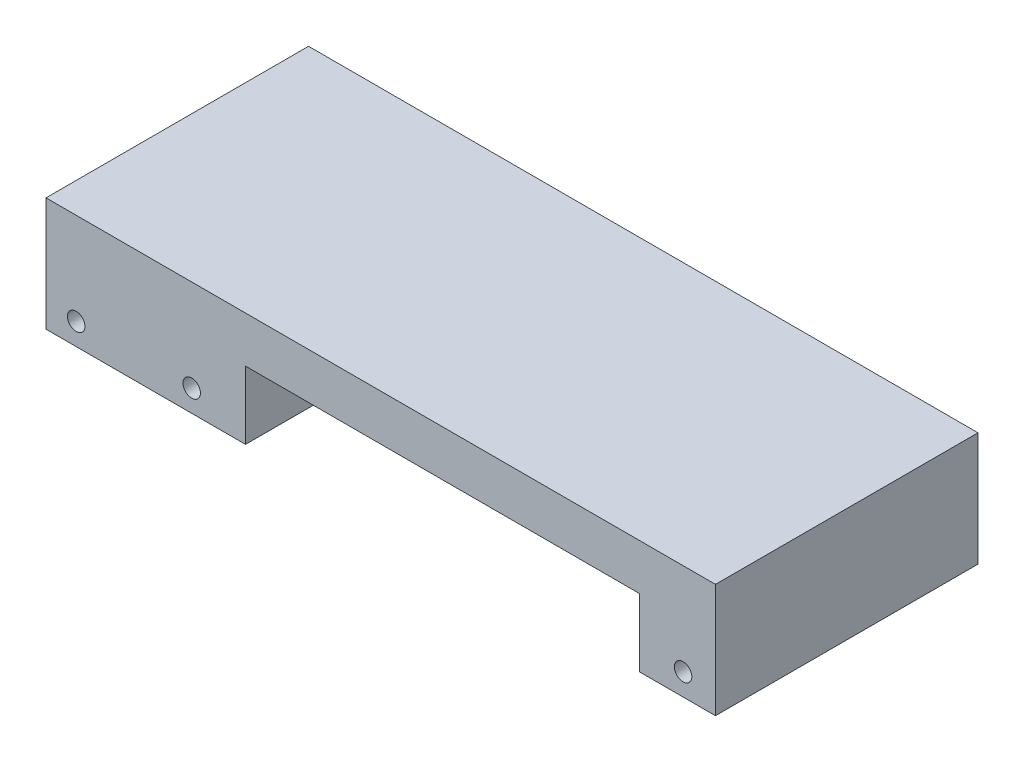
ISO-10303-21;
HEADER;
FILE_DESCRIPTION(('STEP AP214'),'2;1');
FILE_NAME('part.step','',(''),(''),'','','');
FILE_SCHEMA(('AUTOMOTIVE_DESIGN { 1 0 10303 214 1 1 1 1 }'));
ENDSEC;
DATA;
#1=APPLICATION_CONTEXT('core data for automotive mechanical design processes');
#2=APPLICATION_PROTOCOL_DEFINITION('international standard','automotive_design',2000,#1);
#3=PRODUCT_CONTEXT('',#1,'mechanical');
#4=PRODUCT('Part','Part','',(#3));
#5=PRODUCT_RELATED_PRODUCT_CATEGORY('part','',(#4));
#6=PRODUCT_DEFINITION_FORMATION('','',#4);
#7=PRODUCT_DEFINITION_CONTEXT('part definition',#1,'design');
#8=PRODUCT_DEFINITION('design','',#6,#7);
#9=PRODUCT_DEFINITION_SHAPE('','',#8);
#10=(LENGTH_UNIT() NAMED_UNIT(*) SI_UNIT(.MILLI.,.METRE.));
#11=(NAMED_UNIT(*) PLANE_ANGLE_UNIT() SI_UNIT($,.RADIAN.));
#12=(NAMED_UNIT(*) SI_UNIT($,.STERADIAN.) SOLID_ANGLE_UNIT());
#13=UNCERTAINTY_MEASURE_WITH_UNIT(LENGTH_MEASURE(1.E-05),#10,'distance_accuracy_value','');
#14=(GEOMETRIC_REPRESENTATION_CONTEXT(3) GLOBAL_UNCERTAINTY_ASSIGNED_CONTEXT((#13)) GLOBAL_UNIT_ASSIGNED_CONTEXT((#10,
#11,#12)) REPRESENTATION_CONTEXT('',''));
#15=CARTESIAN_POINT('',(0.,0.,0.));
#16=DIRECTION('',(0.,0.,1.));
#17=DIRECTION('',(1.,0.,0.));
#18=AXIS2_PLACEMENT_3D('',#15,#16,#17);
#19=CARTESIAN_POINT('',(29.55,0.,30.));
#20=DIRECTION('',(-1.,0.,0.));
#21=DIRECTION('',(0.,0.,1.));
#22=AXIS2_PLACEMENT_3D('',#19,#20,#21);
#23=PLANE('',#22);
#24=DIRECTION('',(0.,1.,0.));
#25=VECTOR('',#24,1.);
#26=CARTESIAN_POINT('',(29.55,0.,0.));
#27=LINE('',#26,#25);
#28=CARTESIAN_POINT('',(29.55,-6.5,0.));
#29=VERTEX_POINT('',#28);
#30=CARTESIAN_POINT('',(29.55,1.25,0.));
#31=VERTEX_POINT('',#30);
#32=EDGE_CURVE('E172',#29,#31,#27,.T.);
#33=ORIENTED_EDGE('',*,*,#32,.F.);
#34=DIRECTION('',(0.,0.,-1.));
#35=VECTOR('',#34,1.);
#36=CARTESIAN_POINT('',(29.55,-6.5,30.));
#37=LINE('',#36,#35);
#38=CARTESIAN_POINT('',(29.55,-6.5,30.));
#39=VERTEX_POINT('',#38);
#40=EDGE_CURVE('E11',#39,#29,#37,.T.);
#41=ORIENTED_EDGE('',*,*,#40,.F.);
#42=DIRECTION('',(0.,1.,0.));
#43=VECTOR('',#42,1.);
#44=CARTESIAN_POINT('',(29.55,0.,30.));
#45=LINE('',#44,#43);
#46=CARTESIAN_POINT('',(29.55,1.25,30.));
#47=VERTEX_POINT('',#46);
#48=EDGE_CURVE('E264',#39,#47,#45,.T.);
#49=ORIENTED_EDGE('',*,*,#48,.T.);
#50=DIRECTION('',(0.,0.,-1.));
#51=VECTOR('',#50,1.);
#52=CARTESIAN_POINT('',(29.55,1.25,30.));
#53=LINE('',#52,#51);
#54=EDGE_CURVE('E97',#47,#31,#53,.T.);
#55=ORIENTED_EDGE('',*,*,#54,.T.);
#56=EDGE_LOOP('',(#33,#41,#49,#55));
#57=FACE_BOUND('',#56,.T.);
#58=ADVANCED_FACE('F45',(#57),#23,.T.);
#59=CARTESIAN_POINT('',(0.,-6.5,30.));
#60=DIRECTION('',(0.,1.,0.));
#61=DIRECTION('',(0.,0.,1.));
#62=AXIS2_PLACEMENT_3D('',#59,#60,#61);
#63=PLANE('',#62);
#64=DIRECTION('',(1.,0.,0.));
#65=VECTOR('',#64,1.);
#66=CARTESIAN_POINT('',(0.,-6.5,0.));
#67=LINE('',#66,#65);
#68=CARTESIAN_POINT('',(38.25,-6.5,0.));
#69=VERTEX_POINT('',#68);
#70=EDGE_CURVE('E169',#29,#69,#67,.T.);
#71=ORIENTED_EDGE('',*,*,#70,.T.);
#72=DIRECTION('',(0.,0.,-1.));
#73=VECTOR('',#72,1.);
#74=CARTESIAN_POINT('',(38.25,-6.5,30.));
#75=LINE('',#74,#73);
#76=CARTESIAN_POINT('',(38.25,-6.5,30.));
#77=VERTEX_POINT('',#76);
#78=EDGE_CURVE('E55',#77,#69,#75,.T.);
#79=ORIENTED_EDGE('',*,*,#78,.F.);
#80=DIRECTION('',(1.,0.,0.));
#81=VECTOR('',#80,1.);
#82=CARTESIAN_POINT('',(0.,-6.5,30.));
#83=LINE('',#82,#81);
#84=EDGE_CURVE('E137',#39,#77,#83,.T.);
#85=ORIENTED_EDGE('',*,*,#84,.F.);
#86=ORIENTED_EDGE('',*,*,#40,.T.);
#87=EDGE_LOOP('',(#71,#79,#85,#86));
#88=FACE_BOUND('',#87,.T.);
#89=ADVANCED_FACE('F170',(#88),#63,.F.);
#90=CARTESIAN_POINT('',(38.25,0.,30.));
#91=DIRECTION('',(-1.,0.,0.));
#92=DIRECTION('',(0.,0.,1.));
#93=AXIS2_PLACEMENT_3D('',#90,#91,#92);
#94=PLANE('',#93);
#95=DIRECTION('',(0.,1.,0.));
#96=VECTOR('',#95,1.);
#97=CARTESIAN_POINT('',(38.25,0.,0.));
#98=LINE('',#97,#96);
#99=CARTESIAN_POINT('',(38.25,6.5,0.));
#100=VERTEX_POINT('',#99);
#101=EDGE_CURVE('E163',#69,#100,#98,.T.);
#102=ORIENTED_EDGE('',*,*,#101,.T.);
#103=DIRECTION('',(0.,0.,-1.));
#104=VECTOR('',#103,1.);
#105=CARTESIAN_POINT('',(38.25,6.5,30.));
#106=LINE('',#105,#104);
#107=CARTESIAN_POINT('',(38.25,6.5,30.));
#108=VERTEX_POINT('',#107);
#109=EDGE_CURVE('E153',#108,#100,#106,.T.);
#110=ORIENTED_EDGE('',*,*,#109,.F.);
#111=DIRECTION('',(0.,1.,0.));
#112=VECTOR('',#111,1.);
#113=CARTESIAN_POINT('',(38.25,0.,30.));
#114=LINE('',#113,#112);
#115=EDGE_CURVE('E165',#77,#108,#114,.T.);
#116=ORIENTED_EDGE('',*,*,#115,.F.);
#117=ORIENTED_EDGE('',*,*,#78,.T.);
#118=EDGE_LOOP('',(#102,#110,#116,#117));
#119=FACE_BOUND('',#118,.T.);
#120=ADVANCED_FACE('F161',(#119),#94,.F.);
#121=CARTESIAN_POINT('',(0.,6.5,30.));
#122=DIRECTION('',(0.,1.,0.));
#123=DIRECTION('',(0.,0.,1.));
#124=AXIS2_PLACEMENT_3D('',#121,#122,#123);
#125=PLANE('',#124);
#126=DIRECTION('',(1.,0.,0.));
#127=VECTOR('',#126,1.);
#128=CARTESIAN_POINT('',(0.,6.5,0.));
#129=LINE('',#128,#127);
#130=CARTESIAN_POINT('',(-38.25,6.5,0.));
#131=VERTEX_POINT('',#130);
#132=EDGE_CURVE('E176',#131,#100,#129,.T.);
#133=ORIENTED_EDGE('',*,*,#132,.F.);
#134=DIRECTION('',(0.,0.,-1.));
#135=VECTOR('',#134,1.);
#136=CARTESIAN_POINT('',(-38.25,6.5,30.));
#137=LINE('',#136,#135);
#138=CARTESIAN_POINT('',(-38.25,6.5,30.));
#139=VERTEX_POINT('',#138);
#140=EDGE_CURVE('E146',#139,#131,#137,.T.);
#141=ORIENTED_EDGE('',*,*,#140,.F.);
#142=DIRECTION('',(1.,0.,0.));
#143=VECTOR('',#142,1.);
#144=CARTESIAN_POINT('',(0.,6.5,30.));
#145=LINE('',#144,#143);
#146=EDGE_CURVE('E275',#139,#108,#145,.T.);
#147=ORIENTED_EDGE('',*,*,#146,.T.);
#148=ORIENTED_EDGE('',*,*,#109,.T.);
#149=EDGE_LOOP('',(#133,#141,#147,#148));
#150=FACE_BOUND('',#149,.T.);
#151=ADVANCED_FACE('F234',(#150),#125,.T.);
#152=CARTESIAN_POINT('',(-38.25,0.,30.));
#153=DIRECTION('',(-1.,0.,0.));
#154=DIRECTION('',(0.,0.,1.));
#155=AXIS2_PLACEMENT_3D('',#152,#153,#154);
#156=PLANE('',#155);
#157=DIRECTION('',(0.,1.,0.));
#158=VECTOR('',#157,1.);
#159=CARTESIAN_POINT('',(-38.25,0.,0.));
#160=LINE('',#159,#158);
#161=CARTESIAN_POINT('',(-38.25,-6.5,0.));
#162=VERTEX_POINT('',#161);
#163=EDGE_CURVE('E182',#162,#131,#160,.T.);
#164=ORIENTED_EDGE('',*,*,#163,.F.);
#165=DIRECTION('',(0.,0.,-1.));
#166=VECTOR('',#165,1.);
#167=CARTESIAN_POINT('',(-38.25,-6.5,30.));
#168=LINE('',#167,#166);
#169=CARTESIAN_POINT('',(-38.25,-6.5,30.));
#170=VERTEX_POINT('',#169);
#171=EDGE_CURVE('E142',#170,#162,#168,.T.);
#172=ORIENTED_EDGE('',*,*,#171,.F.);
#173=DIRECTION('',(0.,1.,0.));
#174=VECTOR('',#173,1.);
#175=CARTESIAN_POINT('',(-38.25,0.,30.));
#176=LINE('',#175,#174);
#177=EDGE_CURVE('E133',#170,#139,#176,.T.);
#178=ORIENTED_EDGE('',*,*,#177,.T.);
#179=ORIENTED_EDGE('',*,*,#140,.T.);
#180=EDGE_LOOP('',(#164,#172,#178,#179));
#181=FACE_BOUND('',#180,.T.);
#182=ADVANCED_FACE('F237',(#181),#156,.T.);
#183=CARTESIAN_POINT('',(-15.45,-6.5,0.));
#184=VERTEX_POINT('',#183);
#185=EDGE_CURVE('E140',#162,#184,#67,.T.);
#186=ORIENTED_EDGE('',*,*,#185,.T.);
#187=DIRECTION('',(0.,0.,-1.));
#188=VECTOR('',#187,1.);
#189=CARTESIAN_POINT('',(-15.45,-6.5,30.));
#190=LINE('',#189,#188);
#191=CARTESIAN_POINT('',(-15.45,-6.5,30.));
#192=VERTEX_POINT('',#191);
#193=EDGE_CURVE('E122',#192,#184,#190,.T.);
#194=ORIENTED_EDGE('',*,*,#193,.F.);
#195=EDGE_CURVE('E126',#170,#192,#83,.T.);
#196=ORIENTED_EDGE('',*,*,#195,.F.);
#197=ORIENTED_EDGE('',*,*,#171,.T.);
#198=EDGE_LOOP('',(#186,#194,#196,#197));
#199=FACE_BOUND('',#198,.T.);
#200=ADVANCED_FACE('F138',(#199),#63,.F.);
#201=CARTESIAN_POINT('',(-15.45,0.,30.));
#202=DIRECTION('',(-1.,0.,0.));
#203=DIRECTION('',(0.,0.,1.));
#204=AXIS2_PLACEMENT_3D('',#201,#202,#203);
#205=PLANE('',#204);
#206=DIRECTION('',(0.,1.,0.));
#207=VECTOR('',#206,1.);
#208=CARTESIAN_POINT('',(-15.45,0.,0.));
#209=LINE('',#208,#207);
#210=CARTESIAN_POINT('',(-15.45,1.25,0.));
#211=VERTEX_POINT('',#210);
#212=EDGE_CURVE('E181',#184,#211,#209,.T.);
#213=ORIENTED_EDGE('',*,*,#212,.T.);
#214=DIRECTION('',(0.,0.,-1.));
#215=VECTOR('',#214,1.);
#216=CARTESIAN_POINT('',(-15.45,1.25,30.));
#217=LINE('',#216,#215);
#218=CARTESIAN_POINT('',(-15.45,1.25,30.));
#219=VERTEX_POINT('',#218);
#220=EDGE_CURVE('E124',#219,#211,#217,.T.);
#221=ORIENTED_EDGE('',*,*,#220,.F.);
#222=DIRECTION('',(0.,1.,0.));
#223=VECTOR('',#222,1.);
#224=CARTESIAN_POINT('',(-15.45,0.,30.));
#225=LINE('',#224,#223);
#226=EDGE_CURVE('E117',#192,#219,#225,.T.);
#227=ORIENTED_EDGE('',*,*,#226,.F.);
#228=ORIENTED_EDGE('',*,*,#193,.T.);
#229=EDGE_LOOP('',(#213,#221,#227,#228));
#230=FACE_BOUND('',#229,.T.);
#231=ADVANCED_FACE('F120',(#230),#205,.F.);
#232=CARTESIAN_POINT('',(-34.8,-4.,30.));
#233=DIRECTION('',(0.,0.,-1.));
#234=DIRECTION('',(-1.,0.,0.));
#235=AXIS2_PLACEMENT_3D('',#232,#233,#234);
#236=CYLINDRICAL_SURFACE('',#235,0.999999999999998);
#237=CARTESIAN_POINT('',(-34.8,-4.,30.));
#238=DIRECTION('',(0.,0.,1.));
#239=DIRECTION('',(1.,0.,0.));
#240=AXIS2_PLACEMENT_3D('',#237,#238,#239);
#241=CIRCLE('',#240,0.999999999999998);
#242=CARTESIAN_POINT('',(-33.8,-4.,30.));
#243=VERTEX_POINT('',#242);
#244=EDGE_CURVE('E262',#243,#243,#241,.T.);
#245=ORIENTED_EDGE('',*,*,#244,.T.);
#246=EDGE_LOOP('',(#245));
#247=FACE_BOUND('',#246,.T.);
#248=CARTESIAN_POINT('',(-34.8,-4.,0.));
#249=DIRECTION('',(0.,0.,1.));
#250=DIRECTION('',(1.,0.,0.));
#251=AXIS2_PLACEMENT_3D('',#248,#249,#250);
#252=CIRCLE('',#251,0.999999999999998);
#253=CARTESIAN_POINT('',(-33.8,-4.,0.));
#254=VERTEX_POINT('',#253);
#255=EDGE_CURVE('E178',#254,#254,#252,.T.);
#256=ORIENTED_EDGE('',*,*,#255,.F.);
#257=EDGE_LOOP('',(#256));
#258=FACE_BOUND('',#257,.T.);
#259=ADVANCED_FACE('F213',(#247,#258),#236,.F.);
#260=CARTESIAN_POINT('',(-21.6,-4.,30.));
#261=DIRECTION('',(0.,0.,-1.));
#262=DIRECTION('',(-1.,0.,0.));
#263=AXIS2_PLACEMENT_3D('',#260,#261,#262);
#264=CYLINDRICAL_SURFACE('',#263,1.);
#265=CARTESIAN_POINT('',(-21.6,-4.,30.));
#266=DIRECTION('',(0.,0.,1.));
#267=DIRECTION('',(1.,0.,0.));
#268=AXIS2_PLACEMENT_3D('',#265,#266,#267);
#269=CIRCLE('',#268,1.);
#270=CARTESIAN_POINT('',(-20.6,-4.,30.));
#271=VERTEX_POINT('',#270);
#272=EDGE_CURVE('E260',#271,#271,#269,.T.);
#273=ORIENTED_EDGE('',*,*,#272,.T.);
#274=EDGE_LOOP('',(#273));
#275=FACE_BOUND('',#274,.T.);
#276=CARTESIAN_POINT('',(-21.6,-4.,0.));
#277=DIRECTION('',(0.,0.,1.));
#278=DIRECTION('',(1.,0.,0.));
#279=AXIS2_PLACEMENT_3D('',#276,#277,#278);
#280=CIRCLE('',#279,1.);
#281=CARTESIAN_POINT('',(-20.6,-4.,0.));
#282=VERTEX_POINT('',#281);
#283=EDGE_CURVE('E203',#282,#282,#280,.T.);
#284=ORIENTED_EDGE('',*,*,#283,.F.);
#285=EDGE_LOOP('',(#284));
#286=FACE_BOUND('',#285,.T.);
#287=ADVANCED_FACE('F215',(#275,#286),#264,.F.);
#288=CARTESIAN_POINT('',(34.55,-4.,30.));
#289=DIRECTION('',(0.,0.,-1.));
#290=DIRECTION('',(-1.,0.,0.));
#291=AXIS2_PLACEMENT_3D('',#288,#289,#290);
#292=CYLINDRICAL_SURFACE('',#291,0.999999999999998);
#293=CARTESIAN_POINT('',(34.55,-4.,30.));
#294=DIRECTION('',(0.,0.,1.));
#295=DIRECTION('',(1.,0.,0.));
#296=AXIS2_PLACEMENT_3D('',#293,#294,#295);
#297=CIRCLE('',#296,0.999999999999998);
#298=CARTESIAN_POINT('',(35.55,-4.,30.));
#299=VERTEX_POINT('',#298);
#300=EDGE_CURVE('E193',#299,#299,#297,.T.);
#301=ORIENTED_EDGE('',*,*,#300,.T.);
#302=EDGE_LOOP('',(#301));
#303=FACE_BOUND('',#302,.T.);
#304=CARTESIAN_POINT('',(34.55,-4.,0.));
#305=DIRECTION('',(0.,0.,1.));
#306=DIRECTION('',(1.,0.,0.));
#307=AXIS2_PLACEMENT_3D('',#304,#305,#306);
#308=CIRCLE('',#307,0.999999999999998);
#309=CARTESIAN_POINT('',(35.55,-4.,0.));
#310=VERTEX_POINT('',#309);
#311=EDGE_CURVE('E199',#310,#310,#308,.T.);
#312=ORIENTED_EDGE('',*,*,#311,.F.);
#313=EDGE_LOOP('',(#312));
#314=FACE_BOUND('',#313,.T.);
#315=ADVANCED_FACE('F47',(#303,#314),#292,.F.);
#316=CARTESIAN_POINT('',(0.,1.25,30.));
#317=DIRECTION('',(0.,1.,0.));
#318=DIRECTION('',(0.,0.,1.));
#319=AXIS2_PLACEMENT_3D('',#316,#317,#318);
#320=PLANE('',#319);
#321=DIRECTION('',(1.,0.,0.));
#322=VECTOR('',#321,1.);
#323=CARTESIAN_POINT('',(0.,1.25,0.));
#324=LINE('',#323,#322);
#325=EDGE_CURVE('E90',#211,#31,#324,.T.);
#326=ORIENTED_EDGE('',*,*,#325,.T.);
#327=ORIENTED_EDGE('',*,*,#54,.F.);
#328=DIRECTION('',(1.,0.,0.));
#329=VECTOR('',#328,1.);
#330=CARTESIAN_POINT('',(0.,1.25,30.));
#331=LINE('',#330,#329);
#332=EDGE_CURVE('E63',#219,#47,#331,.T.);
#333=ORIENTED_EDGE('',*,*,#332,.F.);
#334=ORIENTED_EDGE('',*,*,#220,.T.);
#335=EDGE_LOOP('',(#326,#327,#333,#334));
#336=FACE_BOUND('',#335,.T.);
#337=ADVANCED_FACE('F243',(#336),#320,.F.);
#338=CARTESIAN_POINT('',(0.,0.,30.));
#339=DIRECTION('',(0.,0.,1.));
#340=DIRECTION('',(1.,0.,0.));
#341=AXIS2_PLACEMENT_3D('',#338,#339,#340);
#342=PLANE('',#341);
#343=ORIENTED_EDGE('',*,*,#300,.F.);
#344=EDGE_LOOP('',(#343));
#345=FACE_BOUND('',#344,.T.);
#346=ORIENTED_EDGE('',*,*,#272,.F.);
#347=EDGE_LOOP('',(#346));
#348=FACE_BOUND('',#347,.T.);
#349=ORIENTED_EDGE('',*,*,#244,.F.);
#350=EDGE_LOOP('',(#349));
#351=FACE_BOUND('',#350,.T.);
#352=ORIENTED_EDGE('',*,*,#48,.F.);
#353=ORIENTED_EDGE('',*,*,#84,.T.);
#354=ORIENTED_EDGE('',*,*,#115,.T.);
#355=ORIENTED_EDGE('',*,*,#146,.F.);
#356=ORIENTED_EDGE('',*,*,#177,.F.);
#357=ORIENTED_EDGE('',*,*,#195,.T.);
#358=ORIENTED_EDGE('',*,*,#226,.T.);
#359=ORIENTED_EDGE('',*,*,#332,.T.);
#360=EDGE_LOOP('',(#352,#353,#354,#355,#356,#357,#358,#359));
#361=FACE_BOUND('',#360,.T.);
#362=ADVANCED_FACE('F130',(#345,#348,#351,#361),#342,.T.);
#363=CARTESIAN_POINT('',(0.,0.,0.));
#364=DIRECTION('',(0.,0.,1.));
#365=DIRECTION('',(1.,0.,0.));
#366=AXIS2_PLACEMENT_3D('',#363,#364,#365);
#367=PLANE('',#366);
#368=ORIENTED_EDGE('',*,*,#311,.T.);
#369=EDGE_LOOP('',(#368));
#370=FACE_BOUND('',#369,.T.);
#371=ORIENTED_EDGE('',*,*,#283,.T.);
#372=EDGE_LOOP('',(#371));
#373=FACE_BOUND('',#372,.T.);
#374=ORIENTED_EDGE('',*,*,#255,.T.);
#375=EDGE_LOOP('',(#374));
#376=FACE_BOUND('',#375,.T.);
#377=ORIENTED_EDGE('',*,*,#32,.T.);
#378=ORIENTED_EDGE('',*,*,#325,.F.);
#379=ORIENTED_EDGE('',*,*,#212,.F.);
#380=ORIENTED_EDGE('',*,*,#185,.F.);
#381=ORIENTED_EDGE('',*,*,#163,.T.);
#382=ORIENTED_EDGE('',*,*,#132,.T.);
#383=ORIENTED_EDGE('',*,*,#101,.F.);
#384=ORIENTED_EDGE('',*,*,#70,.F.);
#385=EDGE_LOOP('',(#377,#378,#379,#380,#381,#382,#383,#384));
#386=FACE_BOUND('',#385,.T.);
#387=ADVANCED_FACE('F211',(#370,#373,#376,#386),#367,.F.);
#388=CLOSED_SHELL('',(#58,#89,#120,#151,#182,#200,#231,#259,#287,#315,#337,#362,#387));
#389=MANIFOLD_SOLID_BREP('B2',#388);
#390=ADVANCED_BREP_SHAPE_REPRESENTATION('',(#18,#389),#14);
#391=SHAPE_DEFINITION_REPRESENTATION(#9,#390);
ENDSEC;
END-ISO-10303-21;
